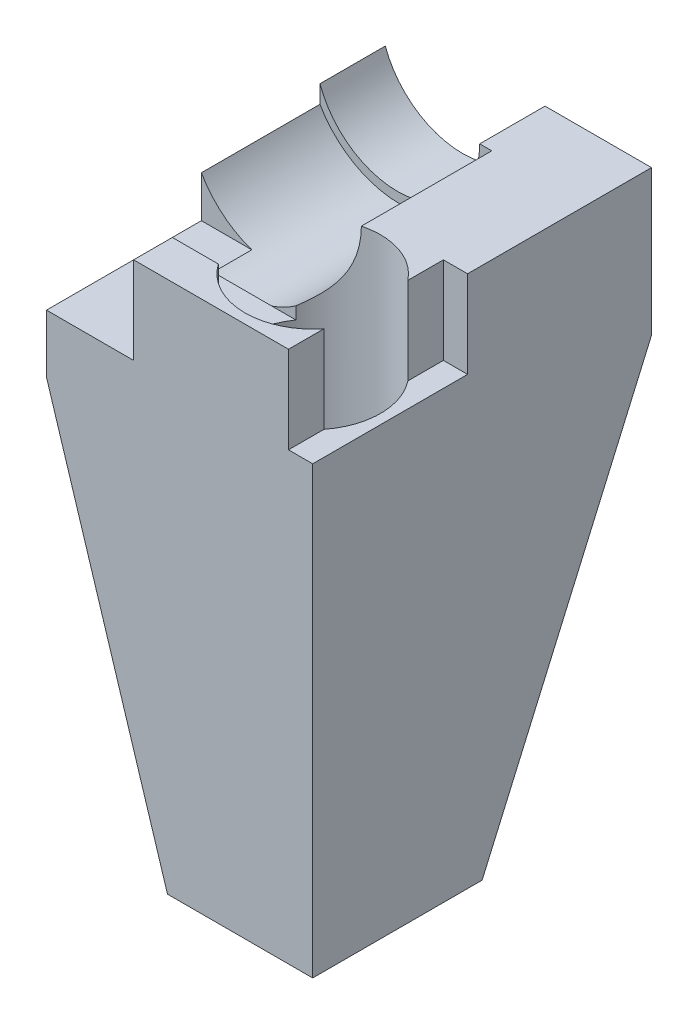
ISO-10303-21;
HEADER;
FILE_DESCRIPTION(('STEP AP214'),'2;1');
FILE_NAME('part.step','',(''),(''),'','','');
FILE_SCHEMA(('AUTOMOTIVE_DESIGN { 1 0 10303 214 1 1 1 1 }'));
ENDSEC;
DATA;
#1=APPLICATION_CONTEXT('core data for automotive mechanical design processes');
#2=APPLICATION_PROTOCOL_DEFINITION('international standard','automotive_design',2000,#1);
#3=PRODUCT_CONTEXT('',#1,'mechanical');
#4=PRODUCT('Part','Part','',(#3));
#5=PRODUCT_RELATED_PRODUCT_CATEGORY('part','',(#4));
#6=PRODUCT_DEFINITION_FORMATION('','',#4);
#7=PRODUCT_DEFINITION_CONTEXT('part definition',#1,'design');
#8=PRODUCT_DEFINITION('design','',#6,#7);
#9=PRODUCT_DEFINITION_SHAPE('','',#8);
#10=(LENGTH_UNIT() NAMED_UNIT(*) SI_UNIT(.MILLI.,.METRE.));
#11=(NAMED_UNIT(*) PLANE_ANGLE_UNIT() SI_UNIT($,.RADIAN.));
#12=(NAMED_UNIT(*) SI_UNIT($,.STERADIAN.) SOLID_ANGLE_UNIT());
#13=UNCERTAINTY_MEASURE_WITH_UNIT(LENGTH_MEASURE(1.E-05),#10,'distance_accuracy_value','');
#14=(GEOMETRIC_REPRESENTATION_CONTEXT(3) GLOBAL_UNCERTAINTY_ASSIGNED_CONTEXT((#13)) GLOBAL_UNIT_ASSIGNED_CONTEXT((#10,
#11,#12)) REPRESENTATION_CONTEXT('',''));
#15=CARTESIAN_POINT('',(0.,0.,0.));
#16=DIRECTION('',(0.,0.,1.));
#17=DIRECTION('',(1.,0.,0.));
#18=AXIS2_PLACEMENT_3D('',#15,#16,#17);
#19=CARTESIAN_POINT('',(0.,110.,0.));
#20=DIRECTION('',(0.,-1.,0.));
#21=DIRECTION('',(0.,0.,-1.));
#22=AXIS2_PLACEMENT_3D('',#19,#20,#21);
#23=PLANE('',#22);
#24=DIRECTION('',(1.,0.,0.));
#25=VECTOR('',#24,1.);
#26=CARTESIAN_POINT('',(0.,110.,0.));
#27=LINE('',#26,#25);
#28=CARTESIAN_POINT('',(18.,110.,0.));
#29=VERTEX_POINT('',#28);
#30=CARTESIAN_POINT('',(50.,110.,0.));
#31=VERTEX_POINT('',#30);
#32=EDGE_CURVE('E211',#29,#31,#27,.T.);
#33=ORIENTED_EDGE('',*,*,#32,.T.);
#34=DIRECTION('',(0.,0.,1.));
#35=VECTOR('',#34,1.);
#36=CARTESIAN_POINT('',(50.,110.,0.));
#37=LINE('',#36,#35);
#38=CARTESIAN_POINT('',(50.,110.,-7.33974596215562));
#39=VERTEX_POINT('',#38);
#40=EDGE_CURVE('E307',#39,#31,#37,.T.);
#41=ORIENTED_EDGE('',*,*,#40,.F.);
#42=CARTESIAN_POINT('',(39.,110.,-16.));
#43=DIRECTION('',(0.,1.,0.));
#44=DIRECTION('',(0.,0.,1.));
#45=AXIS2_PLACEMENT_3D('',#42,#43,#44);
#46=CIRCLE('',#45,14.);
#47=CARTESIAN_POINT('',(27.5108747069239,110.,-8.));
#48=VERTEX_POINT('',#47);
#49=EDGE_CURVE('E315',#48,#39,#46,.T.);
#50=ORIENTED_EDGE('',*,*,#49,.F.);
#51=DIRECTION('',(1.,0.,0.));
#52=VECTOR('',#51,1.);
#53=CARTESIAN_POINT('',(18.,110.,-8.));
#54=LINE('',#53,#52);
#55=CARTESIAN_POINT('',(18.,110.,-8.));
#56=VERTEX_POINT('',#55);
#57=EDGE_CURVE('E331',#56,#48,#54,.T.);
#58=ORIENTED_EDGE('',*,*,#57,.F.);
#59=DIRECTION('',(0.,0.,-1.));
#60=VECTOR('',#59,1.);
#61=CARTESIAN_POINT('',(18.,110.,0.));
#62=LINE('',#61,#60);
#63=EDGE_CURVE('E308',#29,#56,#62,.T.);
#64=ORIENTED_EDGE('',*,*,#63,.F.);
#65=EDGE_LOOP('',(#33,#41,#50,#58,#64));
#66=FACE_BOUND('',#65,.T.);
#67=ADVANCED_FACE('F42',(#66),#23,.F.);
#68=CARTESIAN_POINT('',(0.,110.,0.));
#69=DIRECTION('',(1.,0.,0.));
#70=DIRECTION('',(0.,0.,-1.));
#71=AXIS2_PLACEMENT_3D('',#68,#69,#70);
#72=PLANE('',#71);
#73=DIRECTION('',(0.,-1.,0.));
#74=VECTOR('',#73,1.);
#75=CARTESIAN_POINT('',(0.,110.,-70.));
#76=LINE('',#75,#74);
#77=CARTESIAN_POINT('',(0.,104.255437353462,-70.));
#78=VERTEX_POINT('',#77);
#79=CARTESIAN_POINT('',(0.,80.,-70.));
#80=VERTEX_POINT('',#79);
#81=EDGE_CURVE('E220',#78,#80,#76,.T.);
#82=ORIENTED_EDGE('',*,*,#81,.T.);
#83=DIRECTION('',(0.,0.,1.));
#84=VECTOR('',#83,1.);
#85=CARTESIAN_POINT('',(0.,80.,-70.001));
#86=LINE('',#85,#84);
#87=CARTESIAN_POINT('',(0.,80.,0.));
#88=VERTEX_POINT('',#87);
#89=EDGE_CURVE('E190',#80,#88,#86,.T.);
#90=ORIENTED_EDGE('',*,*,#89,.T.);
#91=DIRECTION('',(0.,-1.,0.));
#92=VECTOR('',#91,1.);
#93=CARTESIAN_POINT('',(0.,110.,0.));
#94=LINE('',#93,#92);
#95=CARTESIAN_POINT('',(0.,92.,0.));
#96=VERTEX_POINT('',#95);
#97=EDGE_CURVE('E200',#96,#88,#94,.T.);
#98=ORIENTED_EDGE('',*,*,#97,.F.);
#99=DIRECTION('',(0.,0.,1.));
#100=VECTOR('',#99,1.);
#101=CARTESIAN_POINT('',(0.,92.,0.));
#102=LINE('',#101,#100);
#103=CARTESIAN_POINT('',(0.,92.,-32.));
#104=VERTEX_POINT('',#103);
#105=EDGE_CURVE('E334',#104,#96,#102,.T.);
#106=ORIENTED_EDGE('',*,*,#105,.F.);
#107=DIRECTION('',(0.,1.,0.));
#108=VECTOR('',#107,1.);
#109=CARTESIAN_POINT('',(0.,92.,-32.));
#110=LINE('',#109,#108);
#111=CARTESIAN_POINT('',(0.,100.579278159292,-32.));
#112=VERTEX_POINT('',#111);
#113=EDGE_CURVE('E287',#104,#112,#110,.T.);
#114=ORIENTED_EDGE('',*,*,#113,.T.);
#115=DIRECTION('',(0.,0.,-1.));
#116=VECTOR('',#115,1.);
#117=CARTESIAN_POINT('',(0.,100.579278159292,29.7401153701776));
#118=LINE('',#117,#116);
#119=CARTESIAN_POINT('',(0.,100.579278159292,-56.5));
#120=VERTEX_POINT('',#119);
#121=EDGE_CURVE('E382',#112,#120,#118,.T.);
#122=ORIENTED_EDGE('',*,*,#121,.T.);
#123=DIRECTION('',(0.,1.,0.));
#124=VECTOR('',#123,1.);
#125=CARTESIAN_POINT('',(0.,110.,-56.5));
#126=LINE('',#125,#124);
#127=CARTESIAN_POINT('',(0.,104.255437353462,-56.5));
#128=VERTEX_POINT('',#127);
#129=EDGE_CURVE('E381',#120,#128,#126,.T.);
#130=ORIENTED_EDGE('',*,*,#129,.T.);
#131=DIRECTION('',(0.,0.,-1.));
#132=VECTOR('',#131,1.);
#133=CARTESIAN_POINT('',(0.,104.255437353462,-56.5));
#134=LINE('',#133,#132);
#135=EDGE_CURVE('E280',#128,#78,#134,.T.);
#136=ORIENTED_EDGE('',*,*,#135,.T.);
#137=EDGE_LOOP('',(#82,#90,#98,#106,#114,#122,#130,#136));
#138=FACE_BOUND('',#137,.T.);
#139=ADVANCED_FACE('F44',(#138),#72,.F.);
#140=CARTESIAN_POINT('',(0.,110.,0.));
#141=DIRECTION('',(0.,0.,-1.));
#142=DIRECTION('',(-1.,0.,0.));
#143=AXIS2_PLACEMENT_3D('',#140,#141,#142);
#144=PLANE('',#143);
#145=ORIENTED_EDGE('',*,*,#97,.T.);
#146=DIRECTION('',(-0.298274993135947,0.95447997803503,0.));
#147=VECTOR('',#146,1.);
#148=CARTESIAN_POINT('',(25.,0.,0.));
#149=LINE('',#148,#147);
#150=CARTESIAN_POINT('',(25.,0.,0.));
#151=VERTEX_POINT('',#150);
#152=EDGE_CURVE('E184',#151,#88,#149,.T.);
#153=ORIENTED_EDGE('',*,*,#152,.F.);
#154=DIRECTION('',(1.,0.,0.));
#155=VECTOR('',#154,1.);
#156=CARTESIAN_POINT('',(0.,0.,0.));
#157=LINE('',#156,#155);
#158=CARTESIAN_POINT('',(55.,0.,0.));
#159=VERTEX_POINT('',#158);
#160=EDGE_CURVE('E196',#151,#159,#157,.T.);
#161=ORIENTED_EDGE('',*,*,#160,.T.);
#162=DIRECTION('',(0.,-1.,0.));
#163=VECTOR('',#162,1.);
#164=CARTESIAN_POINT('',(55.,110.,0.));
#165=LINE('',#164,#163);
#166=CARTESIAN_POINT('',(55.,92.,0.));
#167=VERTEX_POINT('',#166);
#168=EDGE_CURVE('E228',#167,#159,#165,.T.);
#169=ORIENTED_EDGE('',*,*,#168,.F.);
#170=DIRECTION('',(1.,0.,0.));
#171=VECTOR('',#170,1.);
#172=CARTESIAN_POINT('',(55.,92.,0.));
#173=LINE('',#172,#171);
#174=CARTESIAN_POINT('',(50.,92.,0.));
#175=VERTEX_POINT('',#174);
#176=EDGE_CURVE('E299',#175,#167,#173,.T.);
#177=ORIENTED_EDGE('',*,*,#176,.F.);
#178=DIRECTION('',(0.,1.,0.));
#179=VECTOR('',#178,1.);
#180=CARTESIAN_POINT('',(50.,92.,0.));
#181=LINE('',#180,#179);
#182=EDGE_CURVE('E311',#175,#31,#181,.T.);
#183=ORIENTED_EDGE('',*,*,#182,.T.);
#184=ORIENTED_EDGE('',*,*,#32,.F.);
#185=DIRECTION('',(0.,1.,0.));
#186=VECTOR('',#185,1.);
#187=CARTESIAN_POINT('',(18.,92.,0.));
#188=LINE('',#187,#186);
#189=CARTESIAN_POINT('',(18.,92.,0.));
#190=VERTEX_POINT('',#189);
#191=EDGE_CURVE('E321',#190,#29,#188,.T.);
#192=ORIENTED_EDGE('',*,*,#191,.F.);
#193=DIRECTION('',(1.,0.,0.));
#194=VECTOR('',#193,1.);
#195=CARTESIAN_POINT('',(0.,92.,0.));
#196=LINE('',#195,#194);
#197=EDGE_CURVE('E351',#96,#190,#196,.T.);
#198=ORIENTED_EDGE('',*,*,#197,.F.);
#199=EDGE_LOOP('',(#145,#153,#161,#169,#177,#183,#184,#192,#198));
#200=FACE_BOUND('',#199,.T.);
#201=ADVANCED_FACE('F194',(#200),#144,.F.);
#202=CARTESIAN_POINT('',(55.,110.,0.));
#203=DIRECTION('',(-1.,0.,0.));
#204=DIRECTION('',(0.,0.,1.));
#205=AXIS2_PLACEMENT_3D('',#202,#203,#204);
#206=PLANE('',#205);
#207=DIRECTION('',(0.,0.,-1.));
#208=VECTOR('',#207,1.);
#209=CARTESIAN_POINT('',(55.,0.,0.));
#210=LINE('',#209,#208);
#211=CARTESIAN_POINT('',(55.,0.,-35.));
#212=VERTEX_POINT('',#211);
#213=EDGE_CURVE('E205',#159,#212,#210,.T.);
#214=ORIENTED_EDGE('',*,*,#213,.T.);
#215=DIRECTION('',(0.,-0.916157334902189,0.400818834019708));
#216=VECTOR('',#215,1.);
#217=CARTESIAN_POINT('',(55.,80.,-70.));
#218=LINE('',#217,#216);
#219=CARTESIAN_POINT('',(55.,80.,-70.));
#220=VERTEX_POINT('',#219);
#221=EDGE_CURVE('E373',#220,#212,#218,.T.);
#222=ORIENTED_EDGE('',*,*,#221,.F.);
#223=DIRECTION('',(0.,-1.,0.));
#224=VECTOR('',#223,1.);
#225=CARTESIAN_POINT('',(55.,110.,-70.));
#226=LINE('',#225,#224);
#227=CARTESIAN_POINT('',(55.,110.,-70.));
#228=VERTEX_POINT('',#227);
#229=EDGE_CURVE('E224',#228,#220,#226,.T.);
#230=ORIENTED_EDGE('',*,*,#229,.F.);
#231=DIRECTION('',(0.,0.,-1.));
#232=VECTOR('',#231,1.);
#233=CARTESIAN_POINT('',(55.,110.,0.));
#234=LINE('',#233,#232);
#235=CARTESIAN_POINT('',(55.,110.,-32.));
#236=VERTEX_POINT('',#235);
#237=EDGE_CURVE('E362',#236,#228,#234,.T.);
#238=ORIENTED_EDGE('',*,*,#237,.F.);
#239=DIRECTION('',(0.,1.,0.));
#240=VECTOR('',#239,1.);
#241=CARTESIAN_POINT('',(55.,92.,-32.));
#242=LINE('',#241,#240);
#243=CARTESIAN_POINT('',(55.,92.,-32.));
#244=VERTEX_POINT('',#243);
#245=EDGE_CURVE('E302',#244,#236,#242,.T.);
#246=ORIENTED_EDGE('',*,*,#245,.F.);
#247=DIRECTION('',(0.,0.,-1.));
#248=VECTOR('',#247,1.);
#249=CARTESIAN_POINT('',(55.,92.,0.));
#250=LINE('',#249,#248);
#251=EDGE_CURVE('E288',#167,#244,#250,.T.);
#252=ORIENTED_EDGE('',*,*,#251,.F.);
#253=ORIENTED_EDGE('',*,*,#168,.T.);
#254=EDGE_LOOP('',(#214,#222,#230,#238,#246,#252,#253));
#255=FACE_BOUND('',#254,.T.);
#256=ADVANCED_FACE('F372',(#255),#206,.F.);
#257=CARTESIAN_POINT('',(0.,110.,-70.));
#258=DIRECTION('',(0.,0.,1.));
#259=DIRECTION('',(1.,0.,0.));
#260=AXIS2_PLACEMENT_3D('',#257,#258,#259);
#261=PLANE('',#260);
#262=ORIENTED_EDGE('',*,*,#229,.T.);
#263=DIRECTION('',(1.,0.,0.));
#264=VECTOR('',#263,1.);
#265=CARTESIAN_POINT('',(-0.001000000000001,80.,-70.));
#266=LINE('',#265,#264);
#267=EDGE_CURVE('E374',#80,#220,#266,.T.);
#268=ORIENTED_EDGE('',*,*,#267,.F.);
#269=ORIENTED_EDGE('',*,*,#81,.F.);
#270=CARTESIAN_POINT('',(16.,110.,-70.));
#271=DIRECTION('',(0.,0.,-1.));
#272=DIRECTION('',(-1.,0.,0.));
#273=AXIS2_PLACEMENT_3D('',#270,#271,#272);
#274=CIRCLE('',#273,17.);
#275=CARTESIAN_POINT('',(33.,110.,-70.));
#276=VERTEX_POINT('',#275);
#277=EDGE_CURVE('E268',#276,#78,#274,.T.);
#278=ORIENTED_EDGE('',*,*,#277,.F.);
#279=DIRECTION('',(-1.,0.,0.));
#280=VECTOR('',#279,1.);
#281=CARTESIAN_POINT('',(0.,110.,-70.));
#282=LINE('',#281,#280);
#283=EDGE_CURVE('E217',#228,#276,#282,.T.);
#284=ORIENTED_EDGE('',*,*,#283,.F.);
#285=EDGE_LOOP('',(#262,#268,#269,#278,#284));
#286=FACE_BOUND('',#285,.T.);
#287=ADVANCED_FACE('F273',(#286),#261,.F.);
#288=DIRECTION('',(1.,0.,0.));
#289=VECTOR('',#288,1.);
#290=CARTESIAN_POINT('',(0.,110.,-56.5));
#291=LINE('',#290,#289);
#292=CARTESIAN_POINT('',(33.,110.,-56.5));
#293=VERTEX_POINT('',#292);
#294=CARTESIAN_POINT('',(35.5,110.,-56.5));
#295=VERTEX_POINT('',#294);
#296=EDGE_CURVE('E261',#293,#295,#291,.T.);
#297=ORIENTED_EDGE('',*,*,#296,.T.);
#298=DIRECTION('',(0.,0.,-1.));
#299=VECTOR('',#298,1.);
#300=CARTESIAN_POINT('',(35.5,110.,29.7401153701776));
#301=LINE('',#300,#299);
#302=CARTESIAN_POINT('',(35.5,110.,-29.555441711726));
#303=VERTEX_POINT('',#302);
#304=EDGE_CURVE('E276',#295,#303,#301,.F.);
#305=ORIENTED_EDGE('',*,*,#304,.T.);
#306=CARTESIAN_POINT('',(50.,110.,-24.6602540378444));
#307=VERTEX_POINT('',#306);
#308=EDGE_CURVE('E214',#307,#303,#46,.T.);
#309=ORIENTED_EDGE('',*,*,#308,.F.);
#310=CARTESIAN_POINT('',(50.,110.,-32.));
#311=VERTEX_POINT('',#310);
#312=EDGE_CURVE('E293',#311,#307,#37,.T.);
#313=ORIENTED_EDGE('',*,*,#312,.F.);
#314=DIRECTION('',(-1.,0.,0.));
#315=VECTOR('',#314,1.);
#316=CARTESIAN_POINT('',(55.,110.,-32.));
#317=LINE('',#316,#315);
#318=EDGE_CURVE('E303',#236,#311,#317,.T.);
#319=ORIENTED_EDGE('',*,*,#318,.F.);
#320=ORIENTED_EDGE('',*,*,#237,.T.);
#321=ORIENTED_EDGE('',*,*,#283,.T.);
#322=DIRECTION('',(0.,0.,-1.));
#323=VECTOR('',#322,1.);
#324=CARTESIAN_POINT('',(33.,110.,-56.5));
#325=LINE('',#324,#323);
#326=EDGE_CURVE('E51',#276,#293,#325,.F.);
#327=ORIENTED_EDGE('',*,*,#326,.T.);
#328=EDGE_LOOP('',(#297,#305,#309,#313,#319,#320,#321,#327));
#329=FACE_BOUND('',#328,.T.);
#330=ADVANCED_FACE('F259',(#329),#23,.F.);
#331=CARTESIAN_POINT('',(0.,0.,0.));
#332=DIRECTION('',(0.,-1.,0.));
#333=DIRECTION('',(0.,0.,-1.));
#334=AXIS2_PLACEMENT_3D('',#331,#332,#333);
#335=PLANE('',#334);
#336=DIRECTION('',(0.,0.,1.));
#337=VECTOR('',#336,1.);
#338=CARTESIAN_POINT('',(25.,0.,-70.001));
#339=LINE('',#338,#337);
#340=CARTESIAN_POINT('',(25.,0.,-35.));
#341=VERTEX_POINT('',#340);
#342=EDGE_CURVE('E181',#341,#151,#339,.T.);
#343=ORIENTED_EDGE('',*,*,#342,.F.);
#344=DIRECTION('',(1.,0.,0.));
#345=VECTOR('',#344,1.);
#346=CARTESIAN_POINT('',(-0.001000000000001,0.,-35.));
#347=LINE('',#346,#345);
#348=EDGE_CURVE('E58',#341,#212,#347,.T.);
#349=ORIENTED_EDGE('',*,*,#348,.T.);
#350=ORIENTED_EDGE('',*,*,#213,.F.);
#351=ORIENTED_EDGE('',*,*,#160,.F.);
#352=EDGE_LOOP('',(#343,#349,#350,#351));
#353=FACE_BOUND('',#352,.T.);
#354=ADVANCED_FACE('F203',(#353),#335,.T.);
#355=CARTESIAN_POINT('',(39.,2.,-16.));
#356=DIRECTION('',(0.,1.,0.));
#357=DIRECTION('',(0.,0.,1.));
#358=AXIS2_PLACEMENT_3D('',#355,#356,#357);
#359=CYLINDRICAL_SURFACE('',#358,14.);
#360=ORIENTED_EDGE('',*,*,#308,.T.);
#361=CARTESIAN_POINT('',(35.5,110.,-29.555441711726));
#362=CARTESIAN_POINT('',(35.5000032453667,109.748481755481,-29.5554301261157));
#363=CARTESIAN_POINT('',(35.4950056711318,109.496965136913,-29.5541518560034));
#364=CARTESIAN_POINT('',(35.4750335416033,108.994352596112,-29.5489780616202));
#365=CARTESIAN_POINT('',(35.4600588754899,108.743256678583,-29.545082508278));
#366=CARTESIAN_POINT('',(35.4201519686452,108.241842592069,-29.5345888775919));
#367=CARTESIAN_POINT('',(35.3952171072832,107.991524645258,-29.527990088987));
#368=CARTESIAN_POINT('',(35.3354482385351,107.49218345078,-29.511920666886));
#369=CARTESIAN_POINT('',(35.3006142472398,107.243160201011,-29.502450038058));
#370=CARTESIAN_POINT('',(35.1807595078103,106.494930427051,-29.4692424241829));
#371=CARTESIAN_POINT('',(35.0806784014518,105.998242685866,-29.4407801184198));
#372=CARTESIAN_POINT('',(34.8415125028058,105.015555734761,-29.3687144727215));
#373=CARTESIAN_POINT('',(34.7024309231116,104.529555648019,-29.3251123798284));
#374=CARTESIAN_POINT('',(34.386197531237,103.570406603861,-29.218953953745));
#375=CARTESIAN_POINT('',(34.2089242737529,103.097304195648,-29.1563368886807));
#376=CARTESIAN_POINT('',(33.8187642261045,102.16970431097,-29.0076269421037));
#377=CARTESIAN_POINT('',(33.6058732855313,101.71520901042,-28.9215313239766));
#378=CARTESIAN_POINT('',(33.1487174361061,100.831206553903,-28.7210264926796));
#379=CARTESIAN_POINT('',(32.9045862665824,100.40160360737,-28.6067361505831));
#380=CARTESIAN_POINT('',(32.388934808919,99.5702038416153,-28.3441234231085));
#381=CARTESIAN_POINT('',(32.1174277984341,99.1683937004277,-28.1958174916824));
#382=CARTESIAN_POINT('',(31.635569937745,98.509593835067,-27.908789570583));
#383=CARTESIAN_POINT('',(31.4304201048089,98.2444925465914,-27.7798420811935));
#384=CARTESIAN_POINT('',(31.0124597098261,97.7322514650095,-27.5005361717837));
#385=CARTESIAN_POINT('',(30.7996510781328,97.4851071927033,-27.3501831190533));
#386=CARTESIAN_POINT('',(30.3698817940287,97.0104340249273,-27.0269341293476));
#387=CARTESIAN_POINT('',(30.1529253889817,96.7828862526364,-26.8540602988238));
#388=CARTESIAN_POINT('',(29.7183962511893,96.3483200762983,-26.4848951812364));
#389=CARTESIAN_POINT('',(29.5008236511169,96.1412975542894,-26.2886086089299));
#390=CARTESIAN_POINT('',(29.1298265206104,95.8038195842595,-25.931069157731));
#391=CARTESIAN_POINT('',(28.9755764338133,95.6682093939136,-25.7754970759687));
#392=CARTESIAN_POINT('',(28.6703328117437,95.4081124604024,-25.452373049598));
#393=CARTESIAN_POINT('',(28.5193386489256,95.2836235589198,-25.2848234408897));
#394=CARTESIAN_POINT('',(28.2217192837311,95.0454787728393,-24.9376182787361));
#395=CARTESIAN_POINT('',(28.0751056377558,94.9318500556382,-24.7579341905465));
#396=CARTESIAN_POINT('',(27.7880164588882,94.715594069622,-24.3872877920925));
#397=CARTESIAN_POINT('',(27.6475427526004,94.6129700616388,-24.1963221648219));
#398=CARTESIAN_POINT('',(27.5108747069239,94.5157939115878,-24.));
#399=B_SPLINE_CURVE_WITH_KNOTS('',3,(#361,#362,#363,#364,#365,#366,#367,#368,#369,#370,#371,
#372,#373,#374,#375,#376,#377,#378,#379,#380,#381,#382,#383,#384,#385,#386,#387,#388,#389,#390,
#391,#392,#393,#394,#395,#396,#397,#398),.UNSPECIFIED.,.F.,.F.,(4,2,2,2,2,2,2,2,2,2,2,2,2,2,2,2,
2,2,4),(0.,0.754498429184008,1.50900523904492,2.26371069838159,3.01841493097673,
4.53886255541393,6.05918497251009,7.58441514665079,9.10982317468813,10.628906704254,
12.1472569697403,13.2236736664631,14.2998209332984,15.3749197006409,16.4498023335764,
17.2222680329798,17.9945834922029,18.7687829743941,19.5432112312529),.UNSPECIFIED.);
#400=CARTESIAN_POINT('',(27.5108747069239,94.5157939115878,-24.));
#401=VERTEX_POINT('',#400);
#402=EDGE_CURVE('E282',#303,#401,#399,.T.);
#403=ORIENTED_EDGE('',*,*,#402,.T.);
#404=DIRECTION('',(0.,1.,0.));
#405=VECTOR('',#404,1.);
#406=CARTESIAN_POINT('',(27.5108747069239,2.,-24.));
#407=LINE('',#406,#405);
#408=CARTESIAN_POINT('',(27.5108747069239,92.,-24.));
#409=VERTEX_POINT('',#408);
#410=EDGE_CURVE('E241',#401,#409,#407,.F.);
#411=ORIENTED_EDGE('',*,*,#410,.T.);
#412=CARTESIAN_POINT('',(39.,92.,-16.));
#413=DIRECTION('',(0.,-1.,0.));
#414=DIRECTION('',(0.,0.,-1.));
#415=AXIS2_PLACEMENT_3D('',#412,#413,#414);
#416=CIRCLE('',#415,14.);
#417=CARTESIAN_POINT('',(27.5108747069239,92.,-8.));
#418=VERTEX_POINT('',#417);
#419=EDGE_CURVE('E233',#409,#418,#416,.F.);
#420=ORIENTED_EDGE('',*,*,#419,.T.);
#421=DIRECTION('',(0.,1.,0.));
#422=VECTOR('',#421,1.);
#423=CARTESIAN_POINT('',(27.5108747069239,2.,-8.));
#424=LINE('',#423,#422);
#425=EDGE_CURVE('E237',#418,#48,#424,.T.);
#426=ORIENTED_EDGE('',*,*,#425,.T.);
#427=ORIENTED_EDGE('',*,*,#49,.T.);
#428=DIRECTION('',(0.,1.,0.));
#429=VECTOR('',#428,1.);
#430=CARTESIAN_POINT('',(50.,2.,-7.33974596215562));
#431=LINE('',#430,#429);
#432=CARTESIAN_POINT('',(50.,92.,-7.33974596215562));
#433=VERTEX_POINT('',#432);
#434=EDGE_CURVE('E251',#39,#433,#431,.F.);
#435=ORIENTED_EDGE('',*,*,#434,.T.);
#436=CARTESIAN_POINT('',(39.,92.,-16.));
#437=DIRECTION('',(0.,1.,0.));
#438=DIRECTION('',(0.,0.,1.));
#439=AXIS2_PLACEMENT_3D('',#436,#437,#438);
#440=CIRCLE('',#439,14.);
#441=CARTESIAN_POINT('',(50.,92.,-24.6602540378444));
#442=VERTEX_POINT('',#441);
#443=EDGE_CURVE('E244',#442,#433,#440,.F.);
#444=ORIENTED_EDGE('',*,*,#443,.F.);
#445=DIRECTION('',(0.,1.,0.));
#446=VECTOR('',#445,1.);
#447=CARTESIAN_POINT('',(50.,2.,-24.6602540378444));
#448=LINE('',#447,#446);
#449=EDGE_CURVE('E247',#442,#307,#448,.T.);
#450=ORIENTED_EDGE('',*,*,#449,.T.);
#451=EDGE_LOOP('',(#360,#403,#411,#420,#426,#427,#435,#444,#450));
#452=FACE_BOUND('',#451,.T.);
#453=CARTESIAN_POINT('',(39.,2.,-16.));
#454=DIRECTION('',(0.,1.,0.));
#455=DIRECTION('',(0.,0.,1.));
#456=AXIS2_PLACEMENT_3D('',#453,#454,#455);
#457=CIRCLE('',#456,14.);
#458=CARTESIAN_POINT('',(39.,2.,-2.));
#459=VERTEX_POINT('',#458);
#460=EDGE_CURVE('E207',#459,#459,#457,.T.);
#461=ORIENTED_EDGE('',*,*,#460,.F.);
#462=EDGE_LOOP('',(#461));
#463=FACE_BOUND('',#462,.T.);
#464=ADVANCED_FACE('F410',(#452,#463),#359,.F.);
#465=CARTESIAN_POINT('',(39.,2.,-16.));
#466=DIRECTION('',(0.,1.,0.));
#467=DIRECTION('',(0.,0.,1.));
#468=AXIS2_PLACEMENT_3D('',#465,#466,#467);
#469=PLANE('',#468);
#470=ORIENTED_EDGE('',*,*,#460,.T.);
#471=EDGE_LOOP('',(#470));
#472=FACE_BOUND('',#471,.T.);
#473=ADVANCED_FACE('F450',(#472),#469,.T.);
#474=CARTESIAN_POINT('',(18.,92.,-24.));
#475=DIRECTION('',(0.,0.,-1.));
#476=DIRECTION('',(-1.,0.,0.));
#477=AXIS2_PLACEMENT_3D('',#474,#475,#476);
#478=PLANE('',#477);
#479=ORIENTED_EDGE('',*,*,#410,.F.);
#480=CARTESIAN_POINT('',(16.5,110.,-24.));
#481=DIRECTION('',(0.,0.,-1.));
#482=DIRECTION('',(-1.,0.,0.));
#483=AXIS2_PLACEMENT_3D('',#480,#481,#482);
#484=CIRCLE('',#483,19.);
#485=CARTESIAN_POINT('',(22.5827625302982,92.,-24.));
#486=VERTEX_POINT('',#485);
#487=EDGE_CURVE('E664',#486,#401,#484,.F.);
#488=ORIENTED_EDGE('',*,*,#487,.F.);
#489=DIRECTION('',(-1.,0.,0.));
#490=VECTOR('',#489,1.);
#491=CARTESIAN_POINT('',(18.,92.,-24.));
#492=LINE('',#491,#490);
#493=EDGE_CURVE('E340',#409,#486,#492,.T.);
#494=ORIENTED_EDGE('',*,*,#493,.F.);
#495=EDGE_LOOP('',(#479,#488,#494));
#496=FACE_BOUND('',#495,.T.);
#497=ADVANCED_FACE('F446',(#496),#478,.F.);
#498=CARTESIAN_POINT('',(18.,92.,-8.));
#499=DIRECTION('',(0.,0.,1.));
#500=DIRECTION('',(1.,0.,0.));
#501=AXIS2_PLACEMENT_3D('',#498,#499,#500);
#502=PLANE('',#501);
#503=DIRECTION('',(1.,0.,0.));
#504=VECTOR('',#503,1.);
#505=CARTESIAN_POINT('',(18.,92.,-8.));
#506=LINE('',#505,#504);
#507=CARTESIAN_POINT('',(18.,92.,-8.));
#508=VERTEX_POINT('',#507);
#509=EDGE_CURVE('E344',#508,#418,#506,.T.);
#510=ORIENTED_EDGE('',*,*,#509,.F.);
#511=DIRECTION('',(0.,1.,0.));
#512=VECTOR('',#511,1.);
#513=CARTESIAN_POINT('',(18.,92.,-8.));
#514=LINE('',#513,#512);
#515=EDGE_CURVE('E325',#508,#56,#514,.T.);
#516=ORIENTED_EDGE('',*,*,#515,.T.);
#517=ORIENTED_EDGE('',*,*,#57,.T.);
#518=ORIENTED_EDGE('',*,*,#425,.F.);
#519=EDGE_LOOP('',(#510,#516,#517,#518));
#520=FACE_BOUND('',#519,.T.);
#521=ADVANCED_FACE('F442',(#520),#502,.F.);
#522=CARTESIAN_POINT('',(0.,92.,0.));
#523=DIRECTION('',(0.,-1.,0.));
#524=DIRECTION('',(0.,0.,-1.));
#525=AXIS2_PLACEMENT_3D('',#522,#523,#524);
#526=PLANE('',#525);
#527=DIRECTION('',(1.,0.,0.));
#528=VECTOR('',#527,1.);
#529=CARTESIAN_POINT('',(0.,92.,-24.));
#530=LINE('',#529,#528);
#531=CARTESIAN_POINT('',(10.4172374697018,92.,-24.));
#532=VERTEX_POINT('',#531);
#533=EDGE_CURVE('E387',#532,#486,#530,.T.);
#534=ORIENTED_EDGE('',*,*,#533,.F.);
#535=DIRECTION('',(0.,0.,-1.));
#536=VECTOR('',#535,1.);
#537=CARTESIAN_POINT('',(10.4172374697018,92.,29.7401153701776));
#538=LINE('',#537,#536);
#539=CARTESIAN_POINT('',(10.4172374697018,92.,-32.));
#540=VERTEX_POINT('',#539);
#541=EDGE_CURVE('E391',#532,#540,#538,.T.);
#542=ORIENTED_EDGE('',*,*,#541,.T.);
#543=DIRECTION('',(-1.,0.,0.));
#544=VECTOR('',#543,1.);
#545=CARTESIAN_POINT('',(0.,92.,-32.));
#546=LINE('',#545,#544);
#547=EDGE_CURVE('E324',#540,#104,#546,.T.);
#548=ORIENTED_EDGE('',*,*,#547,.T.);
#549=ORIENTED_EDGE('',*,*,#105,.T.);
#550=ORIENTED_EDGE('',*,*,#197,.T.);
#551=DIRECTION('',(0.,0.,-1.));
#552=VECTOR('',#551,1.);
#553=CARTESIAN_POINT('',(18.,92.,0.));
#554=LINE('',#553,#552);
#555=EDGE_CURVE('E347',#190,#508,#554,.T.);
#556=ORIENTED_EDGE('',*,*,#555,.T.);
#557=ORIENTED_EDGE('',*,*,#509,.T.);
#558=ORIENTED_EDGE('',*,*,#419,.F.);
#559=ORIENTED_EDGE('',*,*,#493,.T.);
#560=EDGE_LOOP('',(#534,#542,#548,#549,#550,#556,#557,#558,#559));
#561=FACE_BOUND('',#560,.T.);
#562=ADVANCED_FACE('F445',(#561),#526,.F.);
#563=CARTESIAN_POINT('',(0.,92.,-32.));
#564=DIRECTION('',(0.,0.,-1.));
#565=DIRECTION('',(-1.,0.,0.));
#566=AXIS2_PLACEMENT_3D('',#563,#564,#565);
#567=PLANE('',#566);
#568=ORIENTED_EDGE('',*,*,#547,.F.);
#569=CARTESIAN_POINT('',(16.5,110.,-32.));
#570=DIRECTION('',(0.,0.,-1.));
#571=DIRECTION('',(-1.,0.,0.));
#572=AXIS2_PLACEMENT_3D('',#569,#570,#571);
#573=CIRCLE('',#572,19.);
#574=EDGE_CURVE('E11',#540,#112,#573,.T.);
#575=ORIENTED_EDGE('',*,*,#574,.T.);
#576=ORIENTED_EDGE('',*,*,#113,.F.);
#577=EDGE_LOOP('',(#568,#575,#576));
#578=FACE_BOUND('',#577,.T.);
#579=ADVANCED_FACE('F440',(#578),#567,.F.);
#580=CARTESIAN_POINT('',(18.,92.,0.));
#581=DIRECTION('',(1.,0.,0.));
#582=DIRECTION('',(0.,0.,-1.));
#583=AXIS2_PLACEMENT_3D('',#580,#581,#582);
#584=PLANE('',#583);
#585=ORIENTED_EDGE('',*,*,#63,.T.);
#586=ORIENTED_EDGE('',*,*,#515,.F.);
#587=ORIENTED_EDGE('',*,*,#555,.F.);
#588=ORIENTED_EDGE('',*,*,#191,.T.);
#589=EDGE_LOOP('',(#585,#586,#587,#588));
#590=FACE_BOUND('',#589,.T.);
#591=ADVANCED_FACE('F433',(#590),#584,.F.);
#592=CARTESIAN_POINT('',(50.,92.,0.));
#593=DIRECTION('',(-1.,0.,0.));
#594=DIRECTION('',(0.,0.,1.));
#595=AXIS2_PLACEMENT_3D('',#592,#593,#594);
#596=PLANE('',#595);
#597=ORIENTED_EDGE('',*,*,#40,.T.);
#598=ORIENTED_EDGE('',*,*,#182,.F.);
#599=DIRECTION('',(0.,0.,1.));
#600=VECTOR('',#599,1.);
#601=CARTESIAN_POINT('',(50.,92.,0.));
#602=LINE('',#601,#600);
#603=EDGE_CURVE('E296',#433,#175,#602,.T.);
#604=ORIENTED_EDGE('',*,*,#603,.F.);
#605=ORIENTED_EDGE('',*,*,#434,.F.);
#606=EDGE_LOOP('',(#597,#598,#604,#605));
#607=FACE_BOUND('',#606,.T.);
#608=ADVANCED_FACE('F430',(#607),#596,.F.);
#609=CARTESIAN_POINT('',(50.,92.,-32.));
#610=VERTEX_POINT('',#609);
#611=EDGE_CURVE('E66',#610,#442,#602,.T.);
#612=ORIENTED_EDGE('',*,*,#611,.F.);
#613=DIRECTION('',(0.,1.,0.));
#614=VECTOR('',#613,1.);
#615=CARTESIAN_POINT('',(50.,92.,-32.));
#616=LINE('',#615,#614);
#617=EDGE_CURVE('E316',#610,#311,#616,.T.);
#618=ORIENTED_EDGE('',*,*,#617,.T.);
#619=ORIENTED_EDGE('',*,*,#312,.T.);
#620=ORIENTED_EDGE('',*,*,#449,.F.);
#621=EDGE_LOOP('',(#612,#618,#619,#620));
#622=FACE_BOUND('',#621,.T.);
#623=ADVANCED_FACE('F429',(#622),#596,.F.);
#624=CARTESIAN_POINT('',(0.,92.,0.));
#625=DIRECTION('',(0.,1.,0.));
#626=DIRECTION('',(0.,0.,1.));
#627=AXIS2_PLACEMENT_3D('',#624,#625,#626);
#628=PLANE('',#627);
#629=ORIENTED_EDGE('',*,*,#443,.T.);
#630=ORIENTED_EDGE('',*,*,#603,.T.);
#631=ORIENTED_EDGE('',*,*,#176,.T.);
#632=ORIENTED_EDGE('',*,*,#251,.T.);
#633=DIRECTION('',(-1.,0.,0.));
#634=VECTOR('',#633,1.);
#635=CARTESIAN_POINT('',(55.,92.,-32.));
#636=LINE('',#635,#634);
#637=EDGE_CURVE('E292',#244,#610,#636,.T.);
#638=ORIENTED_EDGE('',*,*,#637,.T.);
#639=ORIENTED_EDGE('',*,*,#611,.T.);
#640=EDGE_LOOP('',(#629,#630,#631,#632,#638,#639));
#641=FACE_BOUND('',#640,.T.);
#642=ADVANCED_FACE('F426',(#641),#628,.T.);
#643=CARTESIAN_POINT('',(55.,92.,-32.));
#644=DIRECTION('',(0.,0.,-1.));
#645=DIRECTION('',(-1.,0.,0.));
#646=AXIS2_PLACEMENT_3D('',#643,#644,#645);
#647=PLANE('',#646);
#648=ORIENTED_EDGE('',*,*,#318,.T.);
#649=ORIENTED_EDGE('',*,*,#617,.F.);
#650=ORIENTED_EDGE('',*,*,#637,.F.);
#651=ORIENTED_EDGE('',*,*,#245,.T.);
#652=EDGE_LOOP('',(#648,#649,#650,#651));
#653=FACE_BOUND('',#652,.T.);
#654=ADVANCED_FACE('F425',(#653),#647,.F.);
#655=CARTESIAN_POINT('',(16.,110.,-56.5));
#656=DIRECTION('',(0.,0.,-1.));
#657=DIRECTION('',(-1.,0.,0.));
#658=AXIS2_PLACEMENT_3D('',#655,#656,#657);
#659=CYLINDRICAL_SURFACE('',#658,17.);
#660=CARTESIAN_POINT('',(16.,110.,-56.5));
#661=DIRECTION('',(0.,0.,-1.));
#662=DIRECTION('',(-1.,0.,0.));
#663=AXIS2_PLACEMENT_3D('',#660,#661,#662);
#664=CIRCLE('',#663,17.);
#665=EDGE_CURVE('E270',#293,#128,#664,.T.);
#666=ORIENTED_EDGE('',*,*,#665,.F.);
#667=ORIENTED_EDGE('',*,*,#326,.F.);
#668=ORIENTED_EDGE('',*,*,#277,.T.);
#669=ORIENTED_EDGE('',*,*,#135,.F.);
#670=EDGE_LOOP('',(#666,#667,#668,#669));
#671=FACE_BOUND('',#670,.T.);
#672=ADVANCED_FACE('F266',(#671),#659,.F.);
#673=CARTESIAN_POINT('',(16.5,110.,29.7401153701776));
#674=DIRECTION('',(0.,0.,-1.));
#675=DIRECTION('',(-1.,0.,0.));
#676=AXIS2_PLACEMENT_3D('',#673,#674,#675);
#677=CYLINDRICAL_SURFACE('',#676,19.);
#678=CARTESIAN_POINT('',(16.5,110.,-56.5));
#679=DIRECTION('',(0.,0.,-1.));
#680=DIRECTION('',(-1.,0.,0.));
#681=AXIS2_PLACEMENT_3D('',#678,#679,#680);
#682=CIRCLE('',#681,19.);
#683=EDGE_CURVE('E661',#295,#120,#682,.T.);
#684=ORIENTED_EDGE('',*,*,#683,.T.);
#685=ORIENTED_EDGE('',*,*,#121,.F.);
#686=ORIENTED_EDGE('',*,*,#574,.F.);
#687=ORIENTED_EDGE('',*,*,#541,.F.);
#688=EDGE_CURVE('E393',#532,#486,#484,.F.);
#689=ORIENTED_EDGE('',*,*,#688,.T.);
#690=ORIENTED_EDGE('',*,*,#487,.T.);
#691=ORIENTED_EDGE('',*,*,#402,.F.);
#692=ORIENTED_EDGE('',*,*,#304,.F.);
#693=EDGE_LOOP('',(#684,#685,#686,#687,#689,#690,#691,#692));
#694=FACE_BOUND('',#693,.T.);
#695=ADVANCED_FACE('F414',(#694),#677,.F.);
#696=CARTESIAN_POINT('',(18.,92.,-24.));
#697=DIRECTION('',(0.,0.,-1.));
#698=DIRECTION('',(-1.,0.,0.));
#699=AXIS2_PLACEMENT_3D('',#696,#697,#698);
#700=PLANE('',#699);
#701=ORIENTED_EDGE('',*,*,#688,.F.);
#702=ORIENTED_EDGE('',*,*,#533,.T.);
#703=EDGE_LOOP('',(#701,#702));
#704=FACE_BOUND('',#703,.T.);
#705=ADVANCED_FACE('F419',(#704),#700,.T.);
#706=CARTESIAN_POINT('',(16.5,110.,-56.5));
#707=DIRECTION('',(0.,0.,-1.));
#708=DIRECTION('',(-1.,0.,0.));
#709=AXIS2_PLACEMENT_3D('',#706,#707,#708);
#710=PLANE('',#709);
#711=ORIENTED_EDGE('',*,*,#683,.F.);
#712=ORIENTED_EDGE('',*,*,#296,.F.);
#713=ORIENTED_EDGE('',*,*,#665,.T.);
#714=ORIENTED_EDGE('',*,*,#129,.F.);
#715=EDGE_LOOP('',(#711,#712,#713,#714));
#716=FACE_BOUND('',#715,.T.);
#717=ADVANCED_FACE('F421',(#716),#710,.F.);
#718=CARTESIAN_POINT('',(-0.001000000000001,80.,-70.));
#719=DIRECTION('',(0.,0.400818834019707,0.916157334902189));
#720=DIRECTION('',(0.,-0.916157334902189,0.400818834019707));
#721=AXIS2_PLACEMENT_3D('',#718,#719,#720);
#722=PLANE('',#721);
#723=ORIENTED_EDGE('',*,*,#348,.F.);
#724=DIRECTION('',(0.27524094128159,-0.880771012101089,0.385337317794226));
#725=VECTOR('',#724,1.);
#726=CARTESIAN_POINT('',(21.2877727272727,11.8791272727273,-40.1971181818182));
#727=LINE('',#726,#725);
#728=EDGE_CURVE('E187',#80,#341,#727,.T.);
#729=ORIENTED_EDGE('',*,*,#728,.F.);
#730=ORIENTED_EDGE('',*,*,#267,.T.);
#731=ORIENTED_EDGE('',*,*,#221,.T.);
#732=EDGE_LOOP('',(#723,#729,#730,#731));
#733=FACE_BOUND('',#732,.T.);
#734=ADVANCED_FACE('F501',(#733),#722,.F.);
#735=CARTESIAN_POINT('',(25.,0.,-70.001));
#736=DIRECTION('',(0.95447997803503,0.298274993135947,0.));
#737=DIRECTION('',(-0.298274993135947,0.95447997803503,0.));
#738=AXIS2_PLACEMENT_3D('',#735,#736,#737);
#739=PLANE('',#738);
#740=ORIENTED_EDGE('',*,*,#728,.T.);
#741=ORIENTED_EDGE('',*,*,#342,.T.);
#742=ORIENTED_EDGE('',*,*,#152,.T.);
#743=ORIENTED_EDGE('',*,*,#89,.F.);
#744=EDGE_LOOP('',(#740,#741,#742,#743));
#745=FACE_BOUND('',#744,.T.);
#746=ADVANCED_FACE('F183',(#745),#739,.F.);
#747=CLOSED_SHELL('',(#67,#139,#201,#256,#287,#330,#354,#464,#473,#497,#521,#562,#579,#591,#608,
#623,#642,#654,#672,#695,#705,#717,#734,#746));
#748=MANIFOLD_SOLID_BREP('B2',#747);
#749=ADVANCED_BREP_SHAPE_REPRESENTATION('',(#18,#748),#14);
#750=SHAPE_DEFINITION_REPRESENTATION(#9,#749);
ENDSEC;
END-ISO-10303-21;
